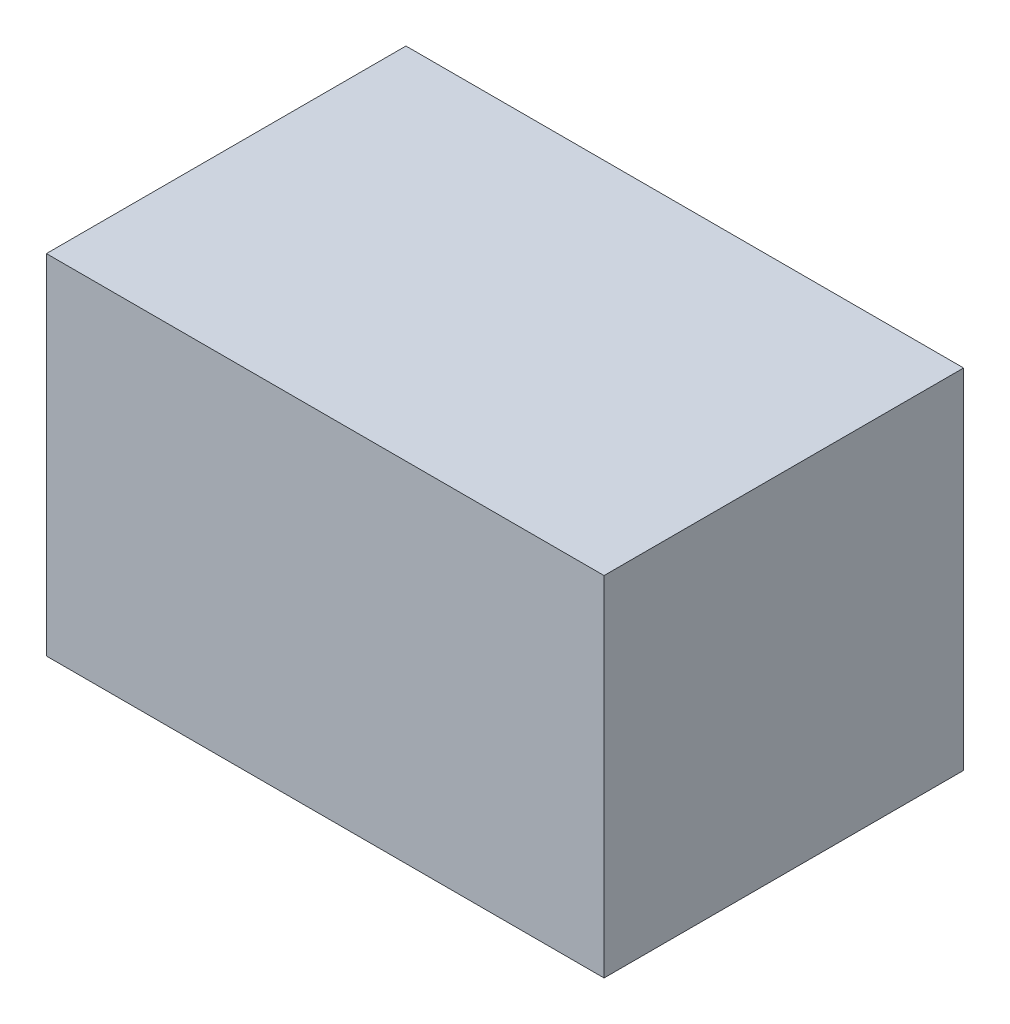
ISO-10303-21;
HEADER;
FILE_DESCRIPTION(('STEP AP214'),'2;1');
FILE_NAME('part.step','',(''),(''),'','','');
FILE_SCHEMA(('AUTOMOTIVE_DESIGN { 1 0 10303 214 1 1 1 1 }'));
ENDSEC;
DATA;
#1=APPLICATION_CONTEXT('core data for automotive mechanical design processes');
#2=APPLICATION_PROTOCOL_DEFINITION('international standard','automotive_design',2000,#1);
#3=PRODUCT_CONTEXT('',#1,'mechanical');
#4=PRODUCT('Part','Part','',(#3));
#5=PRODUCT_RELATED_PRODUCT_CATEGORY('part','',(#4));
#6=PRODUCT_DEFINITION_FORMATION('','',#4);
#7=PRODUCT_DEFINITION_CONTEXT('part definition',#1,'design');
#8=PRODUCT_DEFINITION('design','',#6,#7);
#9=PRODUCT_DEFINITION_SHAPE('','',#8);
#10=(LENGTH_UNIT() NAMED_UNIT(*) SI_UNIT(.MILLI.,.METRE.));
#11=(NAMED_UNIT(*) PLANE_ANGLE_UNIT() SI_UNIT($,.RADIAN.));
#12=(NAMED_UNIT(*) SI_UNIT($,.STERADIAN.) SOLID_ANGLE_UNIT());
#13=UNCERTAINTY_MEASURE_WITH_UNIT(LENGTH_MEASURE(1.E-05),#10,'distance_accuracy_value','');
#14=(GEOMETRIC_REPRESENTATION_CONTEXT(3) GLOBAL_UNCERTAINTY_ASSIGNED_CONTEXT((#13)) GLOBAL_UNIT_ASSIGNED_CONTEXT((#10,
#11,#12)) REPRESENTATION_CONTEXT('',''));
#15=CARTESIAN_POINT('',(0.,0.,0.));
#16=DIRECTION('',(0.,0.,1.));
#17=DIRECTION('',(1.,0.,0.));
#18=AXIS2_PLACEMENT_3D('',#15,#16,#17);
#19=CARTESIAN_POINT('',(0.,95.,0.));
#20=DIRECTION('',(1.,0.,0.));
#21=DIRECTION('',(0.,0.,-1.));
#22=AXIS2_PLACEMENT_3D('',#19,#20,#21);
#23=PLANE('',#22);
#24=DIRECTION('',(0.,0.,1.));
#25=VECTOR('',#24,1.);
#26=CARTESIAN_POINT('',(0.,0.,0.));
#27=LINE('',#26,#25);
#28=CARTESIAN_POINT('',(0.,0.,-98.));
#29=VERTEX_POINT('',#28);
#30=CARTESIAN_POINT('',(0.,0.,0.));
#31=VERTEX_POINT('',#30);
#32=EDGE_CURVE('E98',#29,#31,#27,.T.);
#33=ORIENTED_EDGE('',*,*,#32,.T.);
#34=DIRECTION('',(0.,-1.,0.));
#35=VECTOR('',#34,1.);
#36=CARTESIAN_POINT('',(0.,95.,0.));
#37=LINE('',#36,#35);
#38=CARTESIAN_POINT('',(0.,95.,0.));
#39=VERTEX_POINT('',#38);
#40=EDGE_CURVE('E11',#39,#31,#37,.T.);
#41=ORIENTED_EDGE('',*,*,#40,.F.);
#42=DIRECTION('',(0.,0.,1.));
#43=VECTOR('',#42,1.);
#44=CARTESIAN_POINT('',(0.,95.,0.));
#45=LINE('',#44,#43);
#46=CARTESIAN_POINT('',(0.,95.,-98.));
#47=VERTEX_POINT('',#46);
#48=EDGE_CURVE('E86',#47,#39,#45,.T.);
#49=ORIENTED_EDGE('',*,*,#48,.F.);
#50=DIRECTION('',(0.,-1.,0.));
#51=VECTOR('',#50,1.);
#52=CARTESIAN_POINT('',(0.,95.,-98.));
#53=LINE('',#52,#51);
#54=EDGE_CURVE('E94',#47,#29,#53,.T.);
#55=ORIENTED_EDGE('',*,*,#54,.T.);
#56=EDGE_LOOP('',(#33,#41,#49,#55));
#57=FACE_BOUND('',#56,.T.);
#58=ADVANCED_FACE('F35',(#57),#23,.F.);
#59=CARTESIAN_POINT('',(0.,95.,0.));
#60=DIRECTION('',(0.,0.,-1.));
#61=DIRECTION('',(-1.,0.,0.));
#62=AXIS2_PLACEMENT_3D('',#59,#60,#61);
#63=PLANE('',#62);
#64=DIRECTION('',(1.,0.,0.));
#65=VECTOR('',#64,1.);
#66=CARTESIAN_POINT('',(0.,0.,0.));
#67=LINE('',#66,#65);
#68=CARTESIAN_POINT('',(152.,0.,0.));
#69=VERTEX_POINT('',#68);
#70=EDGE_CURVE('E90',#31,#69,#67,.T.);
#71=ORIENTED_EDGE('',*,*,#70,.T.);
#72=DIRECTION('',(0.,-1.,0.));
#73=VECTOR('',#72,1.);
#74=CARTESIAN_POINT('',(152.,95.,0.));
#75=LINE('',#74,#73);
#76=CARTESIAN_POINT('',(152.,95.,0.));
#77=VERTEX_POINT('',#76);
#78=EDGE_CURVE('E43',#77,#69,#75,.T.);
#79=ORIENTED_EDGE('',*,*,#78,.F.);
#80=DIRECTION('',(1.,0.,0.));
#81=VECTOR('',#80,1.);
#82=CARTESIAN_POINT('',(0.,95.,0.));
#83=LINE('',#82,#81);
#84=EDGE_CURVE('E81',#39,#77,#83,.T.);
#85=ORIENTED_EDGE('',*,*,#84,.F.);
#86=ORIENTED_EDGE('',*,*,#40,.T.);
#87=EDGE_LOOP('',(#71,#79,#85,#86));
#88=FACE_BOUND('',#87,.T.);
#89=ADVANCED_FACE('F89',(#88),#63,.F.);
#90=CARTESIAN_POINT('',(152.,95.,0.));
#91=DIRECTION('',(-1.,0.,0.));
#92=DIRECTION('',(0.,0.,1.));
#93=AXIS2_PLACEMENT_3D('',#90,#91,#92);
#94=PLANE('',#93);
#95=DIRECTION('',(0.,0.,-1.));
#96=VECTOR('',#95,1.);
#97=CARTESIAN_POINT('',(152.,0.,0.));
#98=LINE('',#97,#96);
#99=CARTESIAN_POINT('',(152.,0.,-98.));
#100=VERTEX_POINT('',#99);
#101=EDGE_CURVE('E68',#69,#100,#98,.T.);
#102=ORIENTED_EDGE('',*,*,#101,.T.);
#103=DIRECTION('',(0.,-1.,0.));
#104=VECTOR('',#103,1.);
#105=CARTESIAN_POINT('',(152.,95.,-98.));
#106=LINE('',#105,#104);
#107=CARTESIAN_POINT('',(152.,95.,-98.));
#108=VERTEX_POINT('',#107);
#109=EDGE_CURVE('E91',#108,#100,#106,.T.);
#110=ORIENTED_EDGE('',*,*,#109,.F.);
#111=DIRECTION('',(0.,0.,-1.));
#112=VECTOR('',#111,1.);
#113=CARTESIAN_POINT('',(152.,95.,0.));
#114=LINE('',#113,#112);
#115=EDGE_CURVE('E84',#77,#108,#114,.T.);
#116=ORIENTED_EDGE('',*,*,#115,.F.);
#117=ORIENTED_EDGE('',*,*,#78,.T.);
#118=EDGE_LOOP('',(#102,#110,#116,#117));
#119=FACE_BOUND('',#118,.T.);
#120=ADVANCED_FACE('F92',(#119),#94,.F.);
#121=CARTESIAN_POINT('',(0.,95.,-98.));
#122=DIRECTION('',(0.,0.,1.));
#123=DIRECTION('',(1.,0.,0.));
#124=AXIS2_PLACEMENT_3D('',#121,#122,#123);
#125=PLANE('',#124);
#126=DIRECTION('',(-1.,0.,0.));
#127=VECTOR('',#126,1.);
#128=CARTESIAN_POINT('',(0.,0.,-98.));
#129=LINE('',#128,#127);
#130=EDGE_CURVE('E74',#100,#29,#129,.T.);
#131=ORIENTED_EDGE('',*,*,#130,.T.);
#132=ORIENTED_EDGE('',*,*,#54,.F.);
#133=DIRECTION('',(-1.,0.,0.));
#134=VECTOR('',#133,1.);
#135=CARTESIAN_POINT('',(0.,95.,-98.));
#136=LINE('',#135,#134);
#137=EDGE_CURVE('E51',#108,#47,#136,.T.);
#138=ORIENTED_EDGE('',*,*,#137,.F.);
#139=ORIENTED_EDGE('',*,*,#109,.T.);
#140=EDGE_LOOP('',(#131,#132,#138,#139));
#141=FACE_BOUND('',#140,.T.);
#142=ADVANCED_FACE('F105',(#141),#125,.F.);
#143=CARTESIAN_POINT('',(0.,95.,-98.));
#144=DIRECTION('',(0.,-1.,0.));
#145=DIRECTION('',(0.,0.,-1.));
#146=AXIS2_PLACEMENT_3D('',#143,#144,#145);
#147=PLANE('',#146);
#148=ORIENTED_EDGE('',*,*,#48,.T.);
#149=ORIENTED_EDGE('',*,*,#84,.T.);
#150=ORIENTED_EDGE('',*,*,#115,.T.);
#151=ORIENTED_EDGE('',*,*,#137,.T.);
#152=EDGE_LOOP('',(#148,#149,#150,#151));
#153=FACE_BOUND('',#152,.T.);
#154=ADVANCED_FACE('F82',(#153),#147,.F.);
#155=CARTESIAN_POINT('',(0.,0.,-98.));
#156=DIRECTION('',(0.,-1.,0.));
#157=DIRECTION('',(0.,0.,-1.));
#158=AXIS2_PLACEMENT_3D('',#155,#156,#157);
#159=PLANE('',#158);
#160=ORIENTED_EDGE('',*,*,#32,.F.);
#161=ORIENTED_EDGE('',*,*,#130,.F.);
#162=ORIENTED_EDGE('',*,*,#101,.F.);
#163=ORIENTED_EDGE('',*,*,#70,.F.);
#164=EDGE_LOOP('',(#160,#161,#162,#163));
#165=FACE_BOUND('',#164,.T.);
#166=ADVANCED_FACE('F108',(#165),#159,.T.);
#167=CLOSED_SHELL('',(#58,#89,#120,#142,#154,#166));
#168=MANIFOLD_SOLID_BREP('B2',#167);
#169=ADVANCED_BREP_SHAPE_REPRESENTATION('',(#18,#168),#14);
#170=SHAPE_DEFINITION_REPRESENTATION(#9,#169);
ENDSEC;
END-ISO-10303-21;
